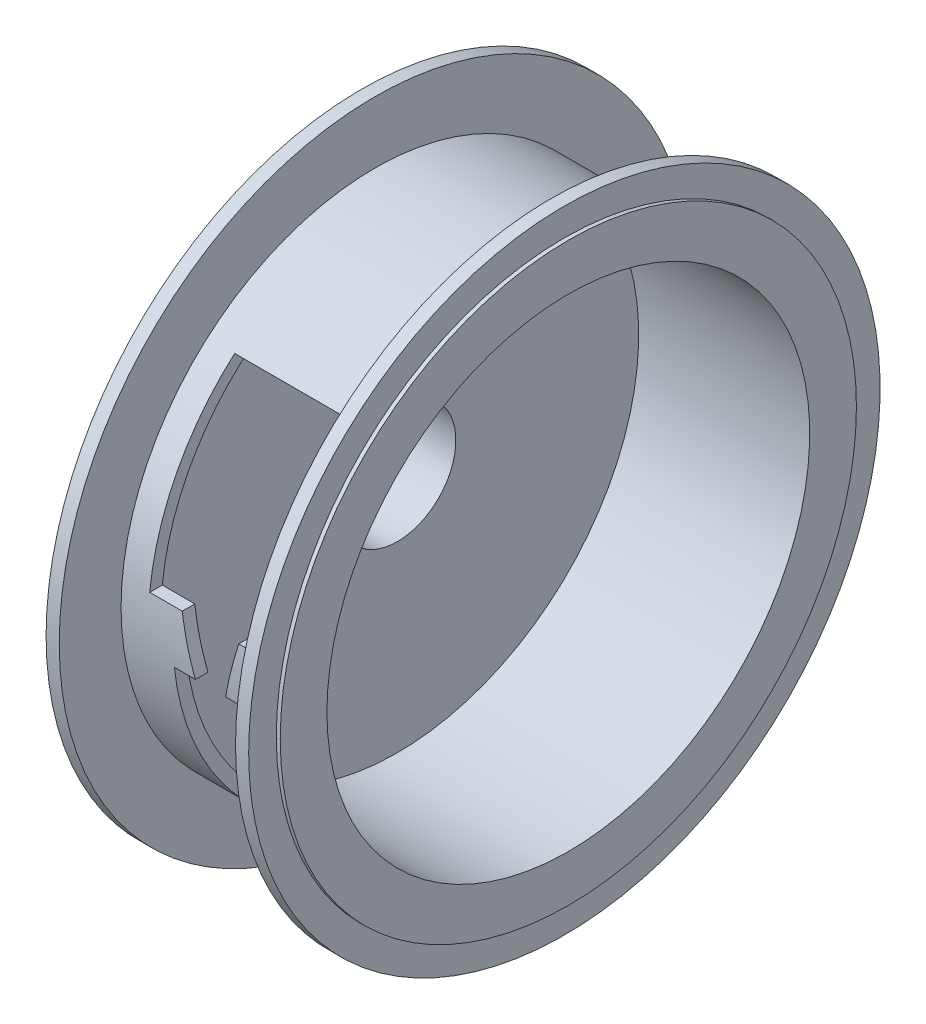
ISO-10303-21;
HEADER;
FILE_DESCRIPTION(('STEP AP214'),'2;1');
FILE_NAME('part.step','',(''),(''),'','','');
FILE_SCHEMA(('AUTOMOTIVE_DESIGN { 1 0 10303 214 1 1 1 1 }'));
ENDSEC;
DATA;
#1=APPLICATION_CONTEXT('core data for automotive mechanical design processes');
#2=APPLICATION_PROTOCOL_DEFINITION('international standard','automotive_design',2000,#1);
#3=PRODUCT_CONTEXT('',#1,'mechanical');
#4=PRODUCT('Part','Part','',(#3));
#5=PRODUCT_RELATED_PRODUCT_CATEGORY('part','',(#4));
#6=PRODUCT_DEFINITION_FORMATION('','',#4);
#7=PRODUCT_DEFINITION_CONTEXT('part definition',#1,'design');
#8=PRODUCT_DEFINITION('design','',#6,#7);
#9=PRODUCT_DEFINITION_SHAPE('','',#8);
#10=(LENGTH_UNIT() NAMED_UNIT(*) SI_UNIT(.MILLI.,.METRE.));
#11=(NAMED_UNIT(*) PLANE_ANGLE_UNIT() SI_UNIT($,.RADIAN.));
#12=(NAMED_UNIT(*) SI_UNIT($,.STERADIAN.) SOLID_ANGLE_UNIT());
#13=UNCERTAINTY_MEASURE_WITH_UNIT(LENGTH_MEASURE(1.E-05),#10,'distance_accuracy_value','');
#14=(GEOMETRIC_REPRESENTATION_CONTEXT(3) GLOBAL_UNCERTAINTY_ASSIGNED_CONTEXT((#13)) GLOBAL_UNIT_ASSIGNED_CONTEXT((#10,
#11,#12)) REPRESENTATION_CONTEXT('',''));
#15=CARTESIAN_POINT('',(0.,0.,0.));
#16=DIRECTION('',(0.,0.,1.));
#17=DIRECTION('',(1.,0.,0.));
#18=AXIS2_PLACEMENT_3D('',#15,#16,#17);
#19=CARTESIAN_POINT('',(-5.36645340598924,0.,0.));
#20=DIRECTION('',(-1.,0.,0.));
#21=DIRECTION('',(0.,0.,1.));
#22=AXIS2_PLACEMENT_3D('',#19,#20,#21);
#23=CYLINDRICAL_SURFACE('',#22,19.3);
#24=CARTESIAN_POINT('',(15.,0.,0.));
#25=DIRECTION('',(-1.,0.,0.));
#26=DIRECTION('',(0.,0.,1.));
#27=AXIS2_PLACEMENT_3D('',#24,#25,#26);
#28=CIRCLE('',#27,19.3);
#29=CARTESIAN_POINT('',(15.,0.,19.3));
#30=VERTEX_POINT('',#29);
#31=EDGE_CURVE('E176',#30,#30,#28,.T.);
#32=ORIENTED_EDGE('',*,*,#31,.T.);
#33=EDGE_LOOP('',(#32));
#34=FACE_BOUND('',#33,.T.);
#35=CARTESIAN_POINT('',(1.6,0.,0.));
#36=DIRECTION('',(-1.,0.,0.));
#37=DIRECTION('',(0.,0.,1.));
#38=AXIS2_PLACEMENT_3D('',#35,#36,#37);
#39=CIRCLE('',#38,19.3);
#40=CARTESIAN_POINT('',(1.6,0.,19.3));
#41=VERTEX_POINT('',#40);
#42=EDGE_CURVE('E179',#41,#41,#39,.T.);
#43=ORIENTED_EDGE('',*,*,#42,.F.);
#44=EDGE_LOOP('',(#43));
#45=FACE_BOUND('',#44,.T.);
#46=CARTESIAN_POINT('',(3.675,0.,0.));
#47=DIRECTION('',(1.,0.,0.));
#48=DIRECTION('',(0.,1.,0.));
#49=AXIS2_PLACEMENT_3D('',#46,#47,#48);
#50=CIRCLE('',#49,19.3);
#51=CARTESIAN_POINT('',(3.675,14.5,12.7373466624725));
#52=VERTEX_POINT('',#51);
#53=CARTESIAN_POINT('',(3.675,2.,19.1960933525548));
#54=VERTEX_POINT('',#53);
#55=EDGE_CURVE('E130',#52,#54,#50,.T.);
#56=ORIENTED_EDGE('',*,*,#55,.F.);
#57=DIRECTION('',(-1.,0.,0.));
#58=VECTOR('',#57,1.);
#59=CARTESIAN_POINT('',(-5.36645340598924,14.5,12.7373466624725));
#60=LINE('',#59,#58);
#61=CARTESIAN_POINT('',(12.925,14.5,12.7373466624725));
#62=VERTEX_POINT('',#61);
#63=EDGE_CURVE('E119',#62,#52,#60,.T.);
#64=ORIENTED_EDGE('',*,*,#63,.F.);
#65=CARTESIAN_POINT('',(12.925,0.,0.));
#66=DIRECTION('',(-1.,0.,0.));
#67=DIRECTION('',(0.,0.,1.));
#68=AXIS2_PLACEMENT_3D('',#65,#66,#67);
#69=CIRCLE('',#68,19.3);
#70=CARTESIAN_POINT('',(12.925,2.,19.1960933525548));
#71=VERTEX_POINT('',#70);
#72=EDGE_CURVE('E124',#71,#62,#69,.T.);
#73=ORIENTED_EDGE('',*,*,#72,.F.);
#74=DIRECTION('',(-1.,0.,0.));
#75=VECTOR('',#74,1.);
#76=CARTESIAN_POINT('',(-5.36645340598924,1.99999999999999,19.1960933525548));
#77=LINE('',#76,#75);
#78=CARTESIAN_POINT('',(10.45,2.,19.1960933525548));
#79=VERTEX_POINT('',#78);
#80=EDGE_CURVE('E259',#79,#71,#77,.F.);
#81=ORIENTED_EDGE('',*,*,#80,.F.);
#82=CARTESIAN_POINT('',(9.95000000000001,0.,0.));
#83=DIRECTION('',(-0.970142500145332,0.242535625036333,0.));
#84=DIRECTION('',(-0.242535625036333,-0.970142500145332,0.));
#85=AXIS2_PLACEMENT_3D('',#82,#83,#84);
#86=ELLIPSE('',#85,19.8939846436052,19.3);
#87=CARTESIAN_POINT('',(9.45,-2.,19.1960933525548));
#88=VERTEX_POINT('',#87);
#89=EDGE_CURVE('E261',#88,#79,#86,.T.);
#90=ORIENTED_EDGE('',*,*,#89,.F.);
#91=DIRECTION('',(-1.,0.,0.));
#92=VECTOR('',#91,1.);
#93=CARTESIAN_POINT('',(-5.36645340598924,-2.00000000000001,19.1960933525548));
#94=LINE('',#93,#92);
#95=CARTESIAN_POINT('',(11.05,-2.,19.1960933525548));
#96=VERTEX_POINT('',#95);
#97=EDGE_CURVE('E263',#96,#88,#94,.T.);
#98=ORIENTED_EDGE('',*,*,#97,.F.);
#99=CARTESIAN_POINT('',(11.05,0.,0.));
#100=DIRECTION('',(-1.,0.,0.));
#101=DIRECTION('',(0.,-1.,0.));
#102=AXIS2_PLACEMENT_3D('',#99,#100,#101);
#103=CIRCLE('',#102,19.3);
#104=CARTESIAN_POINT('',(11.05,-14.5,12.7373466624725));
#105=VERTEX_POINT('',#104);
#106=EDGE_CURVE('E265',#105,#96,#103,.T.);
#107=ORIENTED_EDGE('',*,*,#106,.F.);
#108=DIRECTION('',(-1.,0.,0.));
#109=VECTOR('',#108,1.);
#110=CARTESIAN_POINT('',(-5.36645340598924,-14.5,12.7373466624725));
#111=LINE('',#110,#109);
#112=CARTESIAN_POINT('',(5.55000000000001,-14.5,12.7373466624725));
#113=VERTEX_POINT('',#112);
#114=EDGE_CURVE('E267',#113,#105,#111,.F.);
#115=ORIENTED_EDGE('',*,*,#114,.F.);
#116=CARTESIAN_POINT('',(5.55,0.,0.));
#117=DIRECTION('',(1.,0.,0.));
#118=DIRECTION('',(0.,1.,0.));
#119=AXIS2_PLACEMENT_3D('',#116,#117,#118);
#120=CIRCLE('',#119,19.3);
#121=CARTESIAN_POINT('',(5.55,-2.,19.1960933525548));
#122=VERTEX_POINT('',#121);
#123=EDGE_CURVE('E269',#122,#113,#120,.T.);
#124=ORIENTED_EDGE('',*,*,#123,.F.);
#125=DIRECTION('',(-1.,0.,0.));
#126=VECTOR('',#125,1.);
#127=CARTESIAN_POINT('',(-5.36645340598924,-2.,19.1960933525548));
#128=LINE('',#127,#126);
#129=CARTESIAN_POINT('',(7.15,-2.,19.1960933525548));
#130=VERTEX_POINT('',#129);
#131=EDGE_CURVE('E271',#130,#122,#128,.T.);
#132=ORIENTED_EDGE('',*,*,#131,.F.);
#133=CARTESIAN_POINT('',(6.65,0.,0.));
#134=DIRECTION('',(0.970142500145332,0.242535625036333,0.));
#135=DIRECTION('',(-0.242535625036333,0.970142500145332,0.));
#136=AXIS2_PLACEMENT_3D('',#133,#134,#135);
#137=ELLIPSE('',#136,19.8939846436052,19.3);
#138=CARTESIAN_POINT('',(6.15,2.,19.1960933525548));
#139=VERTEX_POINT('',#138);
#140=EDGE_CURVE('E143',#139,#130,#137,.T.);
#141=ORIENTED_EDGE('',*,*,#140,.F.);
#142=DIRECTION('',(-1.,0.,0.));
#143=VECTOR('',#142,1.);
#144=CARTESIAN_POINT('',(-5.36645340598924,2.,19.1960933525548));
#145=LINE('',#144,#143);
#146=EDGE_CURVE('E137',#54,#139,#145,.F.);
#147=ORIENTED_EDGE('',*,*,#146,.F.);
#148=EDGE_LOOP('',(#56,#64,#73,#81,#90,#98,#107,#115,#124,#132,#141,#147));
#149=FACE_BOUND('',#148,.T.);
#150=ADVANCED_FACE('F34',(#34,#45,#149),#23,.T.);
#151=CARTESIAN_POINT('',(-5.36645340598924,0.,0.));
#152=DIRECTION('',(-1.,0.,0.));
#153=DIRECTION('',(0.,0.,1.));
#154=AXIS2_PLACEMENT_3D('',#151,#152,#153);
#155=CYLINDRICAL_SURFACE('',#154,18.35);
#156=CARTESIAN_POINT('',(3.3,0.,0.));
#157=DIRECTION('',(-1.,0.,0.));
#158=DIRECTION('',(0.,0.,1.));
#159=AXIS2_PLACEMENT_3D('',#156,#157,#158);
#160=CIRCLE('',#159,18.35);
#161=CARTESIAN_POINT('',(3.3,0.,18.35));
#162=VERTEX_POINT('',#161);
#163=EDGE_CURVE('E158',#162,#162,#160,.T.);
#164=ORIENTED_EDGE('',*,*,#163,.T.);
#165=EDGE_LOOP('',(#164));
#166=FACE_BOUND('',#165,.T.);
#167=CARTESIAN_POINT('',(16.3,0.,0.));
#168=DIRECTION('',(-1.,0.,0.));
#169=DIRECTION('',(0.,0.,1.));
#170=AXIS2_PLACEMENT_3D('',#167,#168,#169);
#171=CIRCLE('',#170,18.35);
#172=CARTESIAN_POINT('',(16.3,0.,18.35));
#173=VERTEX_POINT('',#172);
#174=EDGE_CURVE('E161',#173,#173,#171,.T.);
#175=ORIENTED_EDGE('',*,*,#174,.F.);
#176=EDGE_LOOP('',(#175));
#177=FACE_BOUND('',#176,.T.);
#178=CARTESIAN_POINT('',(3.675,0.,0.));
#179=DIRECTION('',(1.,0.,0.));
#180=DIRECTION('',(0.,1.,0.));
#181=AXIS2_PLACEMENT_3D('',#178,#179,#180);
#182=CIRCLE('',#181,18.35);
#183=CARTESIAN_POINT('',(3.675,2.,18.2406825530187));
#184=VERTEX_POINT('',#183);
#185=CARTESIAN_POINT('',(3.675,14.5,11.2459992886359));
#186=VERTEX_POINT('',#185);
#187=EDGE_CURVE('E11',#184,#186,#182,.F.);
#188=ORIENTED_EDGE('',*,*,#187,.F.);
#189=DIRECTION('',(-1.,0.,0.));
#190=VECTOR('',#189,1.);
#191=CARTESIAN_POINT('',(-5.36645340598924,2.,18.2406825530187));
#192=LINE('',#191,#190);
#193=CARTESIAN_POINT('',(6.15,2.,18.2406825530187));
#194=VERTEX_POINT('',#193);
#195=EDGE_CURVE('E42',#194,#184,#192,.T.);
#196=ORIENTED_EDGE('',*,*,#195,.F.);
#197=CARTESIAN_POINT('',(6.65,0.,0.));
#198=DIRECTION('',(0.970142500145332,0.242535625036333,0.));
#199=DIRECTION('',(-0.242535625036333,0.970142500145332,0.));
#200=AXIS2_PLACEMENT_3D('',#197,#198,#199);
#201=ELLIPSE('',#200,18.914747057521,18.35);
#202=CARTESIAN_POINT('',(7.15,-2.,18.2406825530187));
#203=VERTEX_POINT('',#202);
#204=EDGE_CURVE('E215',#203,#194,#201,.F.);
#205=ORIENTED_EDGE('',*,*,#204,.F.);
#206=DIRECTION('',(-1.,0.,0.));
#207=VECTOR('',#206,1.);
#208=CARTESIAN_POINT('',(-5.36645340598924,-2.,18.2406825530187));
#209=LINE('',#208,#207);
#210=CARTESIAN_POINT('',(5.55,-2.,18.2406825530187));
#211=VERTEX_POINT('',#210);
#212=EDGE_CURVE('E213',#211,#203,#209,.F.);
#213=ORIENTED_EDGE('',*,*,#212,.F.);
#214=CARTESIAN_POINT('',(5.55,0.,0.));
#215=DIRECTION('',(1.,0.,0.));
#216=DIRECTION('',(0.,1.,0.));
#217=AXIS2_PLACEMENT_3D('',#214,#215,#216);
#218=CIRCLE('',#217,18.35);
#219=CARTESIAN_POINT('',(5.55000000000001,-14.5,11.2459992886359));
#220=VERTEX_POINT('',#219);
#221=EDGE_CURVE('E211',#220,#211,#218,.F.);
#222=ORIENTED_EDGE('',*,*,#221,.F.);
#223=DIRECTION('',(-1.,0.,0.));
#224=VECTOR('',#223,1.);
#225=CARTESIAN_POINT('',(-5.36645340598924,-14.5,11.2459992886359));
#226=LINE('',#225,#224);
#227=CARTESIAN_POINT('',(11.05,-14.5,11.2459992886359));
#228=VERTEX_POINT('',#227);
#229=EDGE_CURVE('E209',#228,#220,#226,.T.);
#230=ORIENTED_EDGE('',*,*,#229,.F.);
#231=CARTESIAN_POINT('',(11.05,0.,0.));
#232=DIRECTION('',(-1.,0.,0.));
#233=DIRECTION('',(0.,-1.,0.));
#234=AXIS2_PLACEMENT_3D('',#231,#232,#233);
#235=CIRCLE('',#234,18.35);
#236=CARTESIAN_POINT('',(11.05,-2.,18.2406825530187));
#237=VERTEX_POINT('',#236);
#238=EDGE_CURVE('E207',#237,#228,#235,.F.);
#239=ORIENTED_EDGE('',*,*,#238,.F.);
#240=DIRECTION('',(-1.,0.,0.));
#241=VECTOR('',#240,1.);
#242=CARTESIAN_POINT('',(-5.36645340598924,-2.00000000000001,18.2406825530187));
#243=LINE('',#242,#241);
#244=CARTESIAN_POINT('',(9.45,-2.,18.2406825530187));
#245=VERTEX_POINT('',#244);
#246=EDGE_CURVE('E205',#245,#237,#243,.F.);
#247=ORIENTED_EDGE('',*,*,#246,.F.);
#248=CARTESIAN_POINT('',(9.95000000000001,0.,0.));
#249=DIRECTION('',(-0.970142500145332,0.242535625036333,0.));
#250=DIRECTION('',(-0.242535625036333,-0.970142500145332,0.));
#251=AXIS2_PLACEMENT_3D('',#248,#249,#250);
#252=ELLIPSE('',#251,18.914747057521,18.35);
#253=CARTESIAN_POINT('',(10.45,2.,18.2406825530187));
#254=VERTEX_POINT('',#253);
#255=EDGE_CURVE('E203',#254,#245,#252,.F.);
#256=ORIENTED_EDGE('',*,*,#255,.F.);
#257=DIRECTION('',(-1.,0.,0.));
#258=VECTOR('',#257,1.);
#259=CARTESIAN_POINT('',(-5.36645340598924,1.99999999999999,18.2406825530187));
#260=LINE('',#259,#258);
#261=CARTESIAN_POINT('',(12.925,2.,18.2406825530187));
#262=VERTEX_POINT('',#261);
#263=EDGE_CURVE('E201',#262,#254,#260,.T.);
#264=ORIENTED_EDGE('',*,*,#263,.F.);
#265=CARTESIAN_POINT('',(12.925,0.,0.));
#266=DIRECTION('',(-1.,0.,0.));
#267=DIRECTION('',(0.,0.,1.));
#268=AXIS2_PLACEMENT_3D('',#265,#266,#267);
#269=CIRCLE('',#268,18.35);
#270=CARTESIAN_POINT('',(12.925,14.5,11.2459992886359));
#271=VERTEX_POINT('',#270);
#272=EDGE_CURVE('E199',#271,#262,#269,.F.);
#273=ORIENTED_EDGE('',*,*,#272,.F.);
#274=DIRECTION('',(-1.,0.,0.));
#275=VECTOR('',#274,1.);
#276=CARTESIAN_POINT('',(-5.36645340598924,14.5,11.2459992886359));
#277=LINE('',#276,#275);
#278=EDGE_CURVE('E197',#186,#271,#277,.F.);
#279=ORIENTED_EDGE('',*,*,#278,.F.);
#280=EDGE_LOOP('',(#188,#196,#205,#213,#222,#230,#239,#247,#256,#264,#273,#279));
#281=FACE_BOUND('',#280,.T.);
#282=ADVANCED_FACE('F225',(#166,#177,#281),#155,.F.);
#283=CARTESIAN_POINT('',(-5.36645340598924,0.,0.));
#284=DIRECTION('',(-1.,0.,0.));
#285=DIRECTION('',(0.,0.,1.));
#286=AXIS2_PLACEMENT_3D('',#283,#284,#285);
#287=CYLINDRICAL_SURFACE('',#286,18.5);
#288=CARTESIAN_POINT('',(2.,0.,0.));
#289=DIRECTION('',(-1.,0.,0.));
#290=DIRECTION('',(0.,0.,1.));
#291=AXIS2_PLACEMENT_3D('',#288,#289,#290);
#292=CIRCLE('',#291,18.5);
#293=CARTESIAN_POINT('',(2.,0.,18.5));
#294=VERTEX_POINT('',#293);
#295=EDGE_CURVE('E138',#294,#294,#292,.T.);
#296=ORIENTED_EDGE('',*,*,#295,.F.);
#297=EDGE_LOOP('',(#296));
#298=FACE_BOUND('',#297,.T.);
#299=CARTESIAN_POINT('',(0.300000000000001,0.,0.));
#300=DIRECTION('',(-1.,0.,0.));
#301=DIRECTION('',(0.,0.,1.));
#302=AXIS2_PLACEMENT_3D('',#299,#300,#301);
#303=CIRCLE('',#302,18.5);
#304=CARTESIAN_POINT('',(0.300000000000001,0.,18.5));
#305=VERTEX_POINT('',#304);
#306=EDGE_CURVE('E194',#305,#305,#303,.T.);
#307=ORIENTED_EDGE('',*,*,#306,.T.);
#308=EDGE_LOOP('',(#307));
#309=FACE_BOUND('',#308,.T.);
#310=ADVANCED_FACE('F36',(#298,#309),#287,.F.);
#311=CARTESIAN_POINT('',(0.300000000000001,18.5,0.));
#312=DIRECTION('',(1.,0.,0.));
#313=DIRECTION('',(0.,0.,-1.));
#314=AXIS2_PLACEMENT_3D('',#311,#312,#313);
#315=PLANE('',#314);
#316=ORIENTED_EDGE('',*,*,#306,.F.);
#317=EDGE_LOOP('',(#316));
#318=FACE_BOUND('',#317,.T.);
#319=CARTESIAN_POINT('',(0.300000000000001,0.,0.));
#320=DIRECTION('',(-1.,0.,0.));
#321=DIRECTION('',(0.,0.,1.));
#322=AXIS2_PLACEMENT_3D('',#319,#320,#321);
#323=CIRCLE('',#322,21.9);
#324=CARTESIAN_POINT('',(0.300000000000001,0.,21.9));
#325=VERTEX_POINT('',#324);
#326=EDGE_CURVE('E191',#325,#325,#323,.T.);
#327=ORIENTED_EDGE('',*,*,#326,.T.);
#328=EDGE_LOOP('',(#327));
#329=FACE_BOUND('',#328,.T.);
#330=ADVANCED_FACE('F343',(#318,#329),#315,.F.);
#331=CARTESIAN_POINT('',(-5.36645340598924,0.,0.));
#332=DIRECTION('',(-1.,0.,0.));
#333=DIRECTION('',(0.,0.,1.));
#334=AXIS2_PLACEMENT_3D('',#331,#332,#333);
#335=CYLINDRICAL_SURFACE('',#334,21.9);
#336=ORIENTED_EDGE('',*,*,#326,.F.);
#337=EDGE_LOOP('',(#336));
#338=FACE_BOUND('',#337,.T.);
#339=CARTESIAN_POINT('',(0.600000000000001,0.,0.));
#340=DIRECTION('',(-1.,0.,0.));
#341=DIRECTION('',(0.,0.,1.));
#342=AXIS2_PLACEMENT_3D('',#339,#340,#341);
#343=CIRCLE('',#342,21.9);
#344=CARTESIAN_POINT('',(0.600000000000001,0.,21.9));
#345=VERTEX_POINT('',#344);
#346=EDGE_CURVE('E188',#345,#345,#343,.T.);
#347=ORIENTED_EDGE('',*,*,#346,.T.);
#348=EDGE_LOOP('',(#347));
#349=FACE_BOUND('',#348,.T.);
#350=ADVANCED_FACE('F340',(#338,#349),#335,.T.);
#351=CARTESIAN_POINT('',(0.600000000000001,21.9,0.));
#352=DIRECTION('',(1.,0.,0.));
#353=DIRECTION('',(0.,0.,-1.));
#354=AXIS2_PLACEMENT_3D('',#351,#352,#353);
#355=PLANE('',#354);
#356=ORIENTED_EDGE('',*,*,#346,.F.);
#357=EDGE_LOOP('',(#356));
#358=FACE_BOUND('',#357,.T.);
#359=CARTESIAN_POINT('',(0.600000000000001,0.,0.));
#360=DIRECTION('',(-1.,0.,0.));
#361=DIRECTION('',(0.,0.,1.));
#362=AXIS2_PLACEMENT_3D('',#359,#360,#361);
#363=CIRCLE('',#362,24.);
#364=CARTESIAN_POINT('',(0.600000000000001,0.,24.));
#365=VERTEX_POINT('',#364);
#366=EDGE_CURVE('E185',#365,#365,#363,.T.);
#367=ORIENTED_EDGE('',*,*,#366,.T.);
#368=EDGE_LOOP('',(#367));
#369=FACE_BOUND('',#368,.T.);
#370=ADVANCED_FACE('F336',(#358,#369),#355,.F.);
#371=CARTESIAN_POINT('',(-5.36645340598924,0.,0.));
#372=DIRECTION('',(-1.,0.,0.));
#373=DIRECTION('',(0.,0.,1.));
#374=AXIS2_PLACEMENT_3D('',#371,#372,#373);
#375=CYLINDRICAL_SURFACE('',#374,24.);
#376=ORIENTED_EDGE('',*,*,#366,.F.);
#377=EDGE_LOOP('',(#376));
#378=FACE_BOUND('',#377,.T.);
#379=CARTESIAN_POINT('',(1.6,0.,0.));
#380=DIRECTION('',(-1.,0.,0.));
#381=DIRECTION('',(0.,0.,1.));
#382=AXIS2_PLACEMENT_3D('',#379,#380,#381);
#383=CIRCLE('',#382,24.);
#384=CARTESIAN_POINT('',(1.6,0.,24.));
#385=VERTEX_POINT('',#384);
#386=EDGE_CURVE('E182',#385,#385,#383,.T.);
#387=ORIENTED_EDGE('',*,*,#386,.T.);
#388=EDGE_LOOP('',(#387));
#389=FACE_BOUND('',#388,.T.);
#390=ADVANCED_FACE('F332',(#378,#389),#375,.T.);
#391=CARTESIAN_POINT('',(1.6,24.,0.));
#392=DIRECTION('',(-1.,0.,0.));
#393=DIRECTION('',(0.,0.,1.));
#394=AXIS2_PLACEMENT_3D('',#391,#392,#393);
#395=PLANE('',#394);
#396=ORIENTED_EDGE('',*,*,#386,.F.);
#397=EDGE_LOOP('',(#396));
#398=FACE_BOUND('',#397,.T.);
#399=ORIENTED_EDGE('',*,*,#42,.T.);
#400=EDGE_LOOP('',(#399));
#401=FACE_BOUND('',#400,.T.);
#402=ADVANCED_FACE('F329',(#398,#401),#395,.F.);
#403=CARTESIAN_POINT('',(15.,19.3,0.));
#404=DIRECTION('',(1.,0.,0.));
#405=DIRECTION('',(0.,0.,-1.));
#406=AXIS2_PLACEMENT_3D('',#403,#404,#405);
#407=PLANE('',#406);
#408=ORIENTED_EDGE('',*,*,#31,.F.);
#409=EDGE_LOOP('',(#408));
#410=FACE_BOUND('',#409,.T.);
#411=CARTESIAN_POINT('',(15.,0.,0.));
#412=DIRECTION('',(-1.,0.,0.));
#413=DIRECTION('',(0.,0.,1.));
#414=AXIS2_PLACEMENT_3D('',#411,#412,#413);
#415=CIRCLE('',#414,24.);
#416=CARTESIAN_POINT('',(15.,0.,24.));
#417=VERTEX_POINT('',#416);
#418=EDGE_CURVE('E173',#417,#417,#415,.T.);
#419=ORIENTED_EDGE('',*,*,#418,.T.);
#420=EDGE_LOOP('',(#419));
#421=FACE_BOUND('',#420,.T.);
#422=ADVANCED_FACE('F327',(#410,#421),#407,.F.);
#423=CARTESIAN_POINT('',(-5.36645340598924,0.,0.));
#424=DIRECTION('',(-1.,0.,0.));
#425=DIRECTION('',(0.,0.,1.));
#426=AXIS2_PLACEMENT_3D('',#423,#424,#425);
#427=CYLINDRICAL_SURFACE('',#426,24.);
#428=ORIENTED_EDGE('',*,*,#418,.F.);
#429=EDGE_LOOP('',(#428));
#430=FACE_BOUND('',#429,.T.);
#431=CARTESIAN_POINT('',(16.,0.,0.));
#432=DIRECTION('',(-1.,0.,0.));
#433=DIRECTION('',(0.,0.,1.));
#434=AXIS2_PLACEMENT_3D('',#431,#432,#433);
#435=CIRCLE('',#434,24.);
#436=CARTESIAN_POINT('',(16.,0.,24.));
#437=VERTEX_POINT('',#436);
#438=EDGE_CURVE('E170',#437,#437,#435,.T.);
#439=ORIENTED_EDGE('',*,*,#438,.T.);
#440=EDGE_LOOP('',(#439));
#441=FACE_BOUND('',#440,.T.);
#442=ADVANCED_FACE('F404',(#430,#441),#427,.T.);
#443=CARTESIAN_POINT('',(16.,21.9,0.));
#444=DIRECTION('',(-1.,0.,0.));
#445=DIRECTION('',(0.,0.,1.));
#446=AXIS2_PLACEMENT_3D('',#443,#444,#445);
#447=PLANE('',#446);
#448=ORIENTED_EDGE('',*,*,#438,.F.);
#449=EDGE_LOOP('',(#448));
#450=FACE_BOUND('',#449,.T.);
#451=CARTESIAN_POINT('',(16.,0.,0.));
#452=DIRECTION('',(-1.,0.,0.));
#453=DIRECTION('',(0.,0.,1.));
#454=AXIS2_PLACEMENT_3D('',#451,#452,#453);
#455=CIRCLE('',#454,21.9);
#456=CARTESIAN_POINT('',(16.,0.,21.9));
#457=VERTEX_POINT('',#456);
#458=EDGE_CURVE('E167',#457,#457,#455,.T.);
#459=ORIENTED_EDGE('',*,*,#458,.T.);
#460=EDGE_LOOP('',(#459));
#461=FACE_BOUND('',#460,.T.);
#462=ADVANCED_FACE('F401',(#450,#461),#447,.F.);
#463=CARTESIAN_POINT('',(-5.36645340598924,0.,0.));
#464=DIRECTION('',(-1.,0.,0.));
#465=DIRECTION('',(0.,0.,1.));
#466=AXIS2_PLACEMENT_3D('',#463,#464,#465);
#467=CYLINDRICAL_SURFACE('',#466,21.9);
#468=ORIENTED_EDGE('',*,*,#458,.F.);
#469=EDGE_LOOP('',(#468));
#470=FACE_BOUND('',#469,.T.);
#471=CARTESIAN_POINT('',(16.3,0.,0.));
#472=DIRECTION('',(-1.,0.,0.));
#473=DIRECTION('',(0.,0.,1.));
#474=AXIS2_PLACEMENT_3D('',#471,#472,#473);
#475=CIRCLE('',#474,21.9);
#476=CARTESIAN_POINT('',(16.3,0.,21.9));
#477=VERTEX_POINT('',#476);
#478=EDGE_CURVE('E164',#477,#477,#475,.T.);
#479=ORIENTED_EDGE('',*,*,#478,.T.);
#480=EDGE_LOOP('',(#479));
#481=FACE_BOUND('',#480,.T.);
#482=ADVANCED_FACE('F397',(#470,#481),#467,.T.);
#483=CARTESIAN_POINT('',(16.3,21.9,0.));
#484=DIRECTION('',(-1.,0.,0.));
#485=DIRECTION('',(0.,0.,1.));
#486=AXIS2_PLACEMENT_3D('',#483,#484,#485);
#487=PLANE('',#486);
#488=ORIENTED_EDGE('',*,*,#478,.F.);
#489=EDGE_LOOP('',(#488));
#490=FACE_BOUND('',#489,.T.);
#491=ORIENTED_EDGE('',*,*,#174,.T.);
#492=EDGE_LOOP('',(#491));
#493=FACE_BOUND('',#492,.T.);
#494=ADVANCED_FACE('F392',(#490,#493),#487,.F.);
#495=CARTESIAN_POINT('',(3.3,4.45,0.));
#496=DIRECTION('',(-1.,0.,0.));
#497=DIRECTION('',(0.,0.,1.));
#498=AXIS2_PLACEMENT_3D('',#495,#496,#497);
#499=PLANE('',#498);
#500=ORIENTED_EDGE('',*,*,#163,.F.);
#501=EDGE_LOOP('',(#500));
#502=FACE_BOUND('',#501,.T.);
#503=CARTESIAN_POINT('',(3.30000000000001,0.,0.));
#504=DIRECTION('',(-1.,0.,0.));
#505=DIRECTION('',(0.,0.,1.));
#506=AXIS2_PLACEMENT_3D('',#503,#504,#505);
#507=CIRCLE('',#506,4.45);
#508=CARTESIAN_POINT('',(3.30000000000001,0.,4.45));
#509=VERTEX_POINT('',#508);
#510=EDGE_CURVE('E155',#509,#509,#507,.T.);
#511=ORIENTED_EDGE('',*,*,#510,.T.);
#512=EDGE_LOOP('',(#511));
#513=FACE_BOUND('',#512,.T.);
#514=ADVANCED_FACE('F389',(#502,#513),#499,.F.);
#515=CARTESIAN_POINT('',(-5.36645340598924,0.,0.));
#516=DIRECTION('',(-1.,0.,0.));
#517=DIRECTION('',(0.,0.,1.));
#518=AXIS2_PLACEMENT_3D('',#515,#516,#517);
#519=CYLINDRICAL_SURFACE('',#518,4.45);
#520=ORIENTED_EDGE('',*,*,#510,.F.);
#521=EDGE_LOOP('',(#520));
#522=FACE_BOUND('',#521,.T.);
#523=CARTESIAN_POINT('',(0.,0.,0.));
#524=DIRECTION('',(-1.,0.,0.));
#525=DIRECTION('',(0.,0.,1.));
#526=AXIS2_PLACEMENT_3D('',#523,#524,#525);
#527=CIRCLE('',#526,4.45);
#528=CARTESIAN_POINT('',(0.,0.,4.45));
#529=VERTEX_POINT('',#528);
#530=EDGE_CURVE('E152',#529,#529,#527,.T.);
#531=ORIENTED_EDGE('',*,*,#530,.T.);
#532=EDGE_LOOP('',(#531));
#533=FACE_BOUND('',#532,.T.);
#534=ADVANCED_FACE('F385',(#522,#533),#519,.F.);
#535=CARTESIAN_POINT('',(0.,6.1,0.));
#536=DIRECTION('',(1.,0.,0.));
#537=DIRECTION('',(0.,0.,-1.));
#538=AXIS2_PLACEMENT_3D('',#535,#536,#537);
#539=PLANE('',#538);
#540=ORIENTED_EDGE('',*,*,#530,.F.);
#541=EDGE_LOOP('',(#540));
#542=FACE_BOUND('',#541,.T.);
#543=CARTESIAN_POINT('',(0.,0.,0.));
#544=DIRECTION('',(-1.,0.,0.));
#545=DIRECTION('',(0.,0.,1.));
#546=AXIS2_PLACEMENT_3D('',#543,#544,#545);
#547=CIRCLE('',#546,6.1);
#548=CARTESIAN_POINT('',(0.,0.,6.1));
#549=VERTEX_POINT('',#548);
#550=EDGE_CURVE('E149',#549,#549,#547,.T.);
#551=ORIENTED_EDGE('',*,*,#550,.T.);
#552=EDGE_LOOP('',(#551));
#553=FACE_BOUND('',#552,.T.);
#554=ADVANCED_FACE('F377',(#542,#553),#539,.F.);
#555=CARTESIAN_POINT('',(-5.36645340598924,0.,0.));
#556=DIRECTION('',(-1.,0.,0.));
#557=DIRECTION('',(0.,0.,1.));
#558=AXIS2_PLACEMENT_3D('',#555,#556,#557);
#559=CYLINDRICAL_SURFACE('',#558,6.1);
#560=ORIENTED_EDGE('',*,*,#550,.F.);
#561=EDGE_LOOP('',(#560));
#562=FACE_BOUND('',#561,.T.);
#563=CARTESIAN_POINT('',(2.,0.,0.));
#564=DIRECTION('',(-1.,0.,0.));
#565=DIRECTION('',(0.,0.,1.));
#566=AXIS2_PLACEMENT_3D('',#563,#564,#565);
#567=CIRCLE('',#566,6.1);
#568=CARTESIAN_POINT('',(2.,0.,6.1));
#569=VERTEX_POINT('',#568);
#570=EDGE_CURVE('E141',#569,#569,#567,.T.);
#571=ORIENTED_EDGE('',*,*,#570,.T.);
#572=EDGE_LOOP('',(#571));
#573=FACE_BOUND('',#572,.T.);
#574=ADVANCED_FACE('F369',(#562,#573),#559,.T.);
#575=CARTESIAN_POINT('',(2.,18.5,0.));
#576=DIRECTION('',(1.,0.,0.));
#577=DIRECTION('',(0.,0.,-1.));
#578=AXIS2_PLACEMENT_3D('',#575,#576,#577);
#579=PLANE('',#578);
#580=ORIENTED_EDGE('',*,*,#570,.F.);
#581=EDGE_LOOP('',(#580));
#582=FACE_BOUND('',#581,.T.);
#583=ORIENTED_EDGE('',*,*,#295,.T.);
#584=EDGE_LOOP('',(#583));
#585=FACE_BOUND('',#584,.T.);
#586=ADVANCED_FACE('F367',(#582,#585),#579,.F.);
#587=CARTESIAN_POINT('',(3.675,14.5,24.));
#588=DIRECTION('',(1.,0.,0.));
#589=DIRECTION('',(0.,1.,0.));
#590=AXIS2_PLACEMENT_3D('',#587,#588,#589);
#591=PLANE('',#590);
#592=ORIENTED_EDGE('',*,*,#55,.T.);
#593=DIRECTION('',(0.,0.,-1.));
#594=VECTOR('',#593,1.);
#595=CARTESIAN_POINT('',(3.675,2.,24.));
#596=LINE('',#595,#594);
#597=EDGE_CURVE('E125',#54,#184,#596,.T.);
#598=ORIENTED_EDGE('',*,*,#597,.T.);
#599=ORIENTED_EDGE('',*,*,#187,.T.);
#600=DIRECTION('',(0.,0.,-1.));
#601=VECTOR('',#600,1.);
#602=CARTESIAN_POINT('',(3.675,14.5,24.));
#603=LINE('',#602,#601);
#604=EDGE_CURVE('E54',#52,#186,#603,.T.);
#605=ORIENTED_EDGE('',*,*,#604,.F.);
#606=EDGE_LOOP('',(#592,#598,#599,#605));
#607=FACE_BOUND('',#606,.T.);
#608=ADVANCED_FACE('F128',(#607),#591,.T.);
#609=CARTESIAN_POINT('',(3.675,2.,24.));
#610=DIRECTION('',(0.,1.,0.));
#611=DIRECTION('',(0.,0.,1.));
#612=AXIS2_PLACEMENT_3D('',#609,#610,#611);
#613=PLANE('',#612);
#614=ORIENTED_EDGE('',*,*,#146,.T.);
#615=DIRECTION('',(0.,0.,-1.));
#616=VECTOR('',#615,1.);
#617=CARTESIAN_POINT('',(6.15,2.,24.));
#618=LINE('',#617,#616);
#619=EDGE_CURVE('E221',#139,#194,#618,.T.);
#620=ORIENTED_EDGE('',*,*,#619,.T.);
#621=ORIENTED_EDGE('',*,*,#195,.T.);
#622=ORIENTED_EDGE('',*,*,#597,.F.);
#623=EDGE_LOOP('',(#614,#620,#621,#622));
#624=FACE_BOUND('',#623,.T.);
#625=ADVANCED_FACE('F219',(#624),#613,.T.);
#626=CARTESIAN_POINT('',(6.15,2.,24.));
#627=DIRECTION('',(0.970142500145332,0.242535625036333,0.));
#628=DIRECTION('',(-0.242535625036333,0.970142500145332,0.));
#629=AXIS2_PLACEMENT_3D('',#626,#627,#628);
#630=PLANE('',#629);
#631=ORIENTED_EDGE('',*,*,#140,.T.);
#632=DIRECTION('',(0.,0.,-1.));
#633=VECTOR('',#632,1.);
#634=CARTESIAN_POINT('',(7.15,-2.,24.));
#635=LINE('',#634,#633);
#636=EDGE_CURVE('E254',#130,#203,#635,.T.);
#637=ORIENTED_EDGE('',*,*,#636,.T.);
#638=ORIENTED_EDGE('',*,*,#204,.T.);
#639=ORIENTED_EDGE('',*,*,#619,.F.);
#640=EDGE_LOOP('',(#631,#637,#638,#639));
#641=FACE_BOUND('',#640,.T.);
#642=ADVANCED_FACE('F274',(#641),#630,.T.);
#643=CARTESIAN_POINT('',(7.15,-2.,24.));
#644=DIRECTION('',(0.,-1.,0.));
#645=DIRECTION('',(0.,0.,-1.));
#646=AXIS2_PLACEMENT_3D('',#643,#644,#645);
#647=PLANE('',#646);
#648=ORIENTED_EDGE('',*,*,#131,.T.);
#649=DIRECTION('',(0.,0.,-1.));
#650=VECTOR('',#649,1.);
#651=CARTESIAN_POINT('',(5.55,-2.,24.));
#652=LINE('',#651,#650);
#653=EDGE_CURVE('E251',#122,#211,#652,.T.);
#654=ORIENTED_EDGE('',*,*,#653,.T.);
#655=ORIENTED_EDGE('',*,*,#212,.T.);
#656=ORIENTED_EDGE('',*,*,#636,.F.);
#657=EDGE_LOOP('',(#648,#654,#655,#656));
#658=FACE_BOUND('',#657,.T.);
#659=ADVANCED_FACE('F277',(#658),#647,.T.);
#660=CARTESIAN_POINT('',(5.55,-2.,24.));
#661=DIRECTION('',(1.,0.,0.));
#662=DIRECTION('',(0.,1.,0.));
#663=AXIS2_PLACEMENT_3D('',#660,#661,#662);
#664=PLANE('',#663);
#665=ORIENTED_EDGE('',*,*,#123,.T.);
#666=DIRECTION('',(0.,0.,-1.));
#667=VECTOR('',#666,1.);
#668=CARTESIAN_POINT('',(5.55000000000001,-14.5,24.));
#669=LINE('',#668,#667);
#670=EDGE_CURVE('E248',#113,#220,#669,.T.);
#671=ORIENTED_EDGE('',*,*,#670,.T.);
#672=ORIENTED_EDGE('',*,*,#221,.T.);
#673=ORIENTED_EDGE('',*,*,#653,.F.);
#674=EDGE_LOOP('',(#665,#671,#672,#673));
#675=FACE_BOUND('',#674,.T.);
#676=ADVANCED_FACE('F285',(#675),#664,.T.);
#677=CARTESIAN_POINT('',(5.55000000000001,-14.5,24.));
#678=DIRECTION('',(0.,1.,0.));
#679=DIRECTION('',(0.,0.,1.));
#680=AXIS2_PLACEMENT_3D('',#677,#678,#679);
#681=PLANE('',#680);
#682=ORIENTED_EDGE('',*,*,#114,.T.);
#683=DIRECTION('',(0.,0.,-1.));
#684=VECTOR('',#683,1.);
#685=CARTESIAN_POINT('',(11.05,-14.5,24.));
#686=LINE('',#685,#684);
#687=EDGE_CURVE('E245',#105,#228,#686,.T.);
#688=ORIENTED_EDGE('',*,*,#687,.T.);
#689=ORIENTED_EDGE('',*,*,#229,.T.);
#690=ORIENTED_EDGE('',*,*,#670,.F.);
#691=EDGE_LOOP('',(#682,#688,#689,#690));
#692=FACE_BOUND('',#691,.T.);
#693=ADVANCED_FACE('F288',(#692),#681,.T.);
#694=CARTESIAN_POINT('',(11.05,-2.,24.));
#695=DIRECTION('',(-1.,0.,0.));
#696=DIRECTION('',(0.,-1.,0.));
#697=AXIS2_PLACEMENT_3D('',#694,#695,#696);
#698=PLANE('',#697);
#699=ORIENTED_EDGE('',*,*,#106,.T.);
#700=DIRECTION('',(0.,0.,-1.));
#701=VECTOR('',#700,1.);
#702=CARTESIAN_POINT('',(11.05,-2.,24.));
#703=LINE('',#702,#701);
#704=EDGE_CURVE('E242',#96,#237,#703,.T.);
#705=ORIENTED_EDGE('',*,*,#704,.T.);
#706=ORIENTED_EDGE('',*,*,#238,.T.);
#707=ORIENTED_EDGE('',*,*,#687,.F.);
#708=EDGE_LOOP('',(#699,#705,#706,#707));
#709=FACE_BOUND('',#708,.T.);
#710=ADVANCED_FACE('F295',(#709),#698,.T.);
#711=CARTESIAN_POINT('',(9.45,-2.,24.));
#712=DIRECTION('',(0.,-1.,0.));
#713=DIRECTION('',(1.,0.,0.));
#714=AXIS2_PLACEMENT_3D('',#711,#712,#713);
#715=PLANE('',#714);
#716=ORIENTED_EDGE('',*,*,#97,.T.);
#717=DIRECTION('',(0.,0.,-1.));
#718=VECTOR('',#717,1.);
#719=CARTESIAN_POINT('',(9.45,-2.,24.));
#720=LINE('',#719,#718);
#721=EDGE_CURVE('E239',#88,#245,#720,.T.);
#722=ORIENTED_EDGE('',*,*,#721,.T.);
#723=ORIENTED_EDGE('',*,*,#246,.T.);
#724=ORIENTED_EDGE('',*,*,#704,.F.);
#725=EDGE_LOOP('',(#716,#722,#723,#724));
#726=FACE_BOUND('',#725,.T.);
#727=ADVANCED_FACE('F299',(#726),#715,.T.);
#728=CARTESIAN_POINT('',(10.45,2.,24.));
#729=DIRECTION('',(-0.970142500145332,0.242535625036333,0.));
#730=DIRECTION('',(-0.242535625036333,-0.970142500145332,0.));
#731=AXIS2_PLACEMENT_3D('',#728,#729,#730);
#732=PLANE('',#731);
#733=ORIENTED_EDGE('',*,*,#89,.T.);
#734=DIRECTION('',(0.,0.,-1.));
#735=VECTOR('',#734,1.);
#736=CARTESIAN_POINT('',(10.45,2.,24.));
#737=LINE('',#736,#735);
#738=EDGE_CURVE('E234',#79,#254,#737,.T.);
#739=ORIENTED_EDGE('',*,*,#738,.T.);
#740=ORIENTED_EDGE('',*,*,#255,.T.);
#741=ORIENTED_EDGE('',*,*,#721,.F.);
#742=EDGE_LOOP('',(#733,#739,#740,#741));
#743=FACE_BOUND('',#742,.T.);
#744=ADVANCED_FACE('F305',(#743),#732,.T.);
#745=CARTESIAN_POINT('',(12.925,2.,24.));
#746=DIRECTION('',(0.,1.,0.));
#747=DIRECTION('',(-1.,0.,0.));
#748=AXIS2_PLACEMENT_3D('',#745,#746,#747);
#749=PLANE('',#748);
#750=ORIENTED_EDGE('',*,*,#80,.T.);
#751=DIRECTION('',(0.,0.,-1.));
#752=VECTOR('',#751,1.);
#753=CARTESIAN_POINT('',(12.925,2.,24.));
#754=LINE('',#753,#752);
#755=EDGE_CURVE('E232',#71,#262,#754,.T.);
#756=ORIENTED_EDGE('',*,*,#755,.T.);
#757=ORIENTED_EDGE('',*,*,#263,.T.);
#758=ORIENTED_EDGE('',*,*,#738,.F.);
#759=EDGE_LOOP('',(#750,#756,#757,#758));
#760=FACE_BOUND('',#759,.T.);
#761=ADVANCED_FACE('F307',(#760),#749,.T.);
#762=CARTESIAN_POINT('',(12.925,14.5,24.));
#763=DIRECTION('',(-1.,0.,0.));
#764=DIRECTION('',(0.,0.,1.));
#765=AXIS2_PLACEMENT_3D('',#762,#763,#764);
#766=PLANE('',#765);
#767=ORIENTED_EDGE('',*,*,#72,.T.);
#768=DIRECTION('',(0.,0.,-1.));
#769=VECTOR('',#768,1.);
#770=CARTESIAN_POINT('',(12.925,14.5,24.));
#771=LINE('',#770,#769);
#772=EDGE_CURVE('E49',#62,#271,#771,.T.);
#773=ORIENTED_EDGE('',*,*,#772,.T.);
#774=ORIENTED_EDGE('',*,*,#272,.T.);
#775=ORIENTED_EDGE('',*,*,#755,.F.);
#776=EDGE_LOOP('',(#767,#773,#774,#775));
#777=FACE_BOUND('',#776,.T.);
#778=ADVANCED_FACE('F229',(#777),#766,.T.);
#779=CARTESIAN_POINT('',(12.925,14.5,24.));
#780=DIRECTION('',(0.,-1.,0.));
#781=DIRECTION('',(1.,0.,0.));
#782=AXIS2_PLACEMENT_3D('',#779,#780,#781);
#783=PLANE('',#782);
#784=ORIENTED_EDGE('',*,*,#63,.T.);
#785=ORIENTED_EDGE('',*,*,#604,.T.);
#786=ORIENTED_EDGE('',*,*,#278,.T.);
#787=ORIENTED_EDGE('',*,*,#772,.F.);
#788=EDGE_LOOP('',(#784,#785,#786,#787));
#789=FACE_BOUND('',#788,.T.);
#790=ADVANCED_FACE('F120',(#789),#783,.T.);
#791=CLOSED_SHELL('',(#150,#282,#310,#330,#350,#370,#390,#402,#422,#442,#462,#482,#494,#514,
#534,#554,#574,#586,#608,#625,#642,#659,#676,#693,#710,#727,#744,#761,#778,#790));
#792=MANIFOLD_SOLID_BREP('B2',#791);
#793=ADVANCED_BREP_SHAPE_REPRESENTATION('',(#18,#792),#14);
#794=SHAPE_DEFINITION_REPRESENTATION(#9,#793);
ENDSEC;
END-ISO-10303-21;
